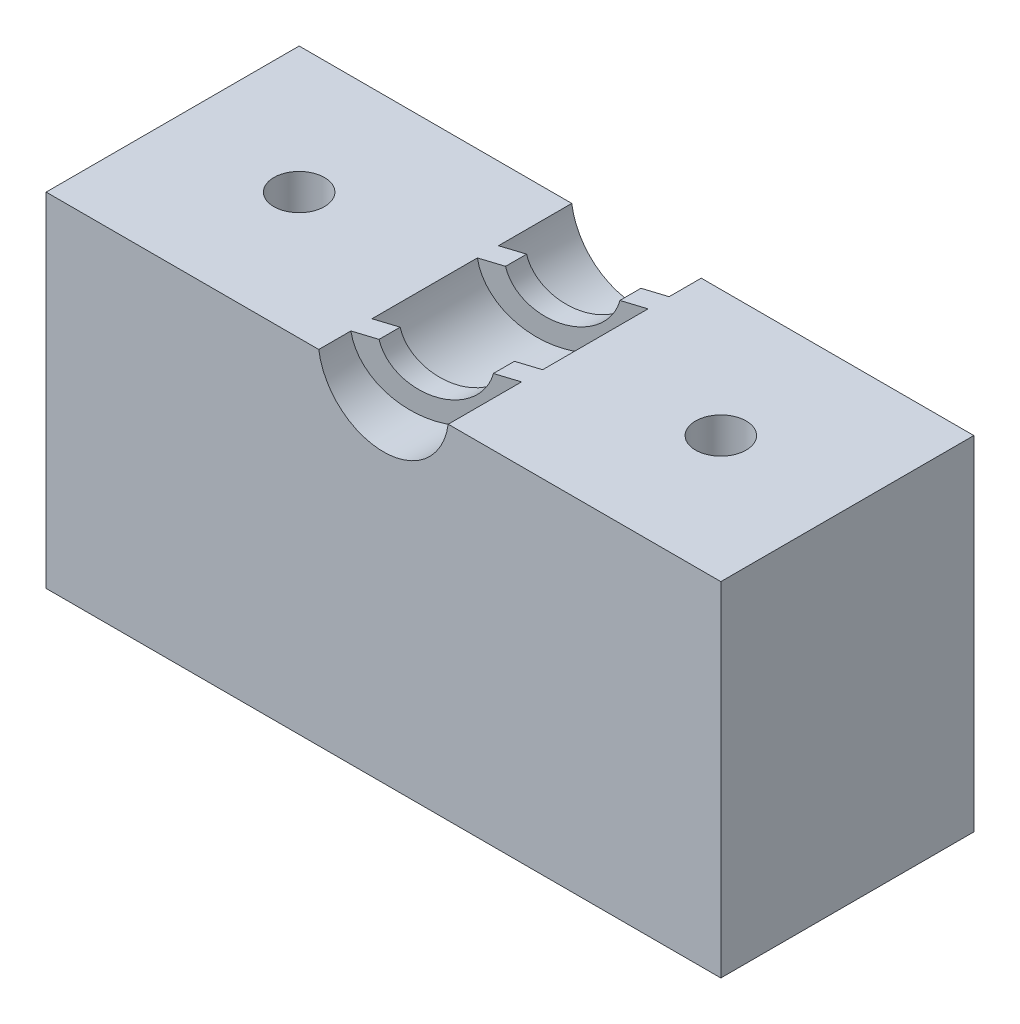
ISO-10303-21;
HEADER;
FILE_DESCRIPTION(('STEP AP214'),'2;1');
FILE_NAME('part.step','',(''),(''),'','','');
FILE_SCHEMA(('AUTOMOTIVE_DESIGN { 1 0 10303 214 1 1 1 1 }'));
ENDSEC;
DATA;
#1=APPLICATION_CONTEXT('core data for automotive mechanical design processes');
#2=APPLICATION_PROTOCOL_DEFINITION('international standard','automotive_design',2000,#1);
#3=PRODUCT_CONTEXT('',#1,'mechanical');
#4=PRODUCT('Part','Part','',(#3));
#5=PRODUCT_RELATED_PRODUCT_CATEGORY('part','',(#4));
#6=PRODUCT_DEFINITION_FORMATION('','',#4);
#7=PRODUCT_DEFINITION_CONTEXT('part definition',#1,'design');
#8=PRODUCT_DEFINITION('design','',#6,#7);
#9=PRODUCT_DEFINITION_SHAPE('','',#8);
#10=(LENGTH_UNIT() NAMED_UNIT(*) SI_UNIT(.MILLI.,.METRE.));
#11=(NAMED_UNIT(*) PLANE_ANGLE_UNIT() SI_UNIT($,.RADIAN.));
#12=(NAMED_UNIT(*) SI_UNIT($,.STERADIAN.) SOLID_ANGLE_UNIT());
#13=UNCERTAINTY_MEASURE_WITH_UNIT(LENGTH_MEASURE(1.E-05),#10,'distance_accuracy_value','');
#14=(GEOMETRIC_REPRESENTATION_CONTEXT(3) GLOBAL_UNCERTAINTY_ASSIGNED_CONTEXT((#13)) GLOBAL_UNIT_ASSIGNED_CONTEXT((#10,
#11,#12)) REPRESENTATION_CONTEXT('',''));
#15=CARTESIAN_POINT('',(0.,0.,0.));
#16=DIRECTION('',(0.,0.,1.));
#17=DIRECTION('',(1.,0.,0.));
#18=AXIS2_PLACEMENT_3D('',#15,#16,#17);
#19=CARTESIAN_POINT('',(0.,0.,3.));
#20=DIRECTION('',(0.,0.,-1.));
#21=DIRECTION('',(-1.,0.,0.));
#22=AXIS2_PLACEMENT_3D('',#19,#20,#21);
#23=CYLINDRICAL_SURFACE('',#22,1.55);
#24=CARTESIAN_POINT('',(0.,0.,-3.));
#25=DIRECTION('',(0.,0.,1.));
#26=DIRECTION('',(1.,0.,0.));
#27=AXIS2_PLACEMENT_3D('',#24,#25,#26);
#28=CIRCLE('',#27,1.55);
#29=CARTESIAN_POINT('',(-1.53514305660554,-0.214092960547071,-3.));
#30=VERTEX_POINT('',#29);
#31=CARTESIAN_POINT('',(1.53514305660554,-0.214092960547071,-3.));
#32=VERTEX_POINT('',#31);
#33=EDGE_CURVE('E235',#30,#32,#28,.T.);
#34=ORIENTED_EDGE('',*,*,#33,.F.);
#35=DIRECTION('',(0.,0.,-1.));
#36=VECTOR('',#35,1.);
#37=CARTESIAN_POINT('',(-1.53514305660554,-0.214092960547071,3.));
#38=LINE('',#37,#36);
#39=CARTESIAN_POINT('',(-1.53514305660554,-0.214092960547072,-1.26125398185195));
#40=VERTEX_POINT('',#39);
#41=EDGE_CURVE('E209',#30,#40,#38,.F.);
#42=ORIENTED_EDGE('',*,*,#41,.T.);
#43=CARTESIAN_POINT('',(0.,0.,-1.75));
#44=DIRECTION('',(-0.303367903708314,0.,-0.952873504196451));
#45=DIRECTION('',(0.952873504196451,0.,-0.303367903708314));
#46=AXIS2_PLACEMENT_3D('',#43,#44,#45);
#47=ELLIPSE('',#46,1.62665872560608,1.55);
#48=CARTESIAN_POINT('',(1.53514305660553,-0.214092960547071,-2.23874601814805));
#49=VERTEX_POINT('',#48);
#50=EDGE_CURVE('E229',#49,#40,#47,.T.);
#51=ORIENTED_EDGE('',*,*,#50,.F.);
#52=DIRECTION('',(0.,0.,-1.));
#53=VECTOR('',#52,1.);
#54=CARTESIAN_POINT('',(1.53514305660554,-0.214092960547071,3.));
#55=LINE('',#54,#53);
#56=EDGE_CURVE('E61',#32,#49,#55,.F.);
#57=ORIENTED_EDGE('',*,*,#56,.F.);
#58=EDGE_LOOP('',(#34,#42,#51,#57));
#59=FACE_BOUND('',#58,.T.);
#60=ADVANCED_FACE('F38',(#59),#23,.F.);
#61=CARTESIAN_POINT('',(0.,0.,1.75));
#62=DIRECTION('',(0.303367903708314,0.,0.952873504196451));
#63=DIRECTION('',(0.952873504196451,0.,-0.303367903708314));
#64=AXIS2_PLACEMENT_3D('',#61,#62,#63);
#65=ELLIPSE('',#64,1.62665872560608,1.55);
#66=CARTESIAN_POINT('',(-1.53514305660554,-0.214092960547072,2.23874601814805));
#67=VERTEX_POINT('',#66);
#68=CARTESIAN_POINT('',(1.53514305660553,-0.214092960547071,1.26125398185195));
#69=VERTEX_POINT('',#68);
#70=EDGE_CURVE('E152',#67,#69,#65,.T.);
#71=ORIENTED_EDGE('',*,*,#70,.F.);
#72=CARTESIAN_POINT('',(-1.53514305660554,-0.214092960547071,3.));
#73=VERTEX_POINT('',#72);
#74=EDGE_CURVE('E213',#67,#73,#38,.F.);
#75=ORIENTED_EDGE('',*,*,#74,.T.);
#76=CARTESIAN_POINT('',(0.,0.,3.));
#77=DIRECTION('',(0.,0.,1.));
#78=DIRECTION('',(1.,0.,0.));
#79=AXIS2_PLACEMENT_3D('',#76,#77,#78);
#80=CIRCLE('',#79,1.55);
#81=CARTESIAN_POINT('',(1.53514305660554,-0.214092960547071,3.));
#82=VERTEX_POINT('',#81);
#83=EDGE_CURVE('E236',#73,#82,#80,.T.);
#84=ORIENTED_EDGE('',*,*,#83,.T.);
#85=EDGE_CURVE('E201',#69,#82,#55,.F.);
#86=ORIENTED_EDGE('',*,*,#85,.F.);
#87=EDGE_LOOP('',(#71,#75,#84,#86));
#88=FACE_BOUND('',#87,.T.);
#89=ADVANCED_FACE('F281',(#88),#23,.F.);
#90=CARTESIAN_POINT('',(0.,0.,3.));
#91=DIRECTION('',(0.,0.,-1.));
#92=DIRECTION('',(-1.,0.,0.));
#93=AXIS2_PLACEMENT_3D('',#90,#91,#92);
#94=PLANE('',#93);
#95=DIRECTION('',(-1.,0.,0.));
#96=VECTOR('',#95,1.);
#97=CARTESIAN_POINT('',(0.,-0.214092960547071,3.));
#98=LINE('',#97,#96);
#99=CARTESIAN_POINT('',(-8.,-0.214092960547072,3.));
#100=VERTEX_POINT('',#99);
#101=EDGE_CURVE('E149',#73,#100,#98,.T.);
#102=ORIENTED_EDGE('',*,*,#101,.T.);
#103=DIRECTION('',(0.,-1.,0.));
#104=VECTOR('',#103,1.);
#105=CARTESIAN_POINT('',(-8.,-8.,3.));
#106=LINE('',#105,#104);
#107=CARTESIAN_POINT('',(-8.,-8.35500000000079,3.));
#108=VERTEX_POINT('',#107);
#109=EDGE_CURVE('E141',#100,#108,#106,.T.);
#110=ORIENTED_EDGE('',*,*,#109,.T.);
#111=DIRECTION('',(-1.,0.,0.));
#112=VECTOR('',#111,1.);
#113=CARTESIAN_POINT('',(8.,-8.35500000000079,3.));
#114=LINE('',#113,#112);
#115=CARTESIAN_POINT('',(8.,-8.35500000000079,3.));
#116=VERTEX_POINT('',#115);
#117=EDGE_CURVE('E146',#116,#108,#114,.T.);
#118=ORIENTED_EDGE('',*,*,#117,.F.);
#119=DIRECTION('',(0.,1.,0.));
#120=VECTOR('',#119,1.);
#121=CARTESIAN_POINT('',(8.,-8.,3.));
#122=LINE('',#121,#120);
#123=CARTESIAN_POINT('',(8.,-0.214092960547071,3.));
#124=VERTEX_POINT('',#123);
#125=EDGE_CURVE('E153',#116,#124,#122,.T.);
#126=ORIENTED_EDGE('',*,*,#125,.T.);
#127=DIRECTION('',(1.,0.,0.));
#128=VECTOR('',#127,1.);
#129=CARTESIAN_POINT('',(0.,-0.214092960547071,3.));
#130=LINE('',#129,#128);
#131=EDGE_CURVE('E179',#82,#124,#130,.T.);
#132=ORIENTED_EDGE('',*,*,#131,.F.);
#133=ORIENTED_EDGE('',*,*,#83,.F.);
#134=EDGE_LOOP('',(#102,#110,#118,#126,#132,#133));
#135=FACE_BOUND('',#134,.T.);
#136=ADVANCED_FACE('F143',(#135),#94,.F.);
#137=CARTESIAN_POINT('',(0.,0.,-3.));
#138=DIRECTION('',(0.,0.,-1.));
#139=DIRECTION('',(-1.,0.,0.));
#140=AXIS2_PLACEMENT_3D('',#137,#138,#139);
#141=PLANE('',#140);
#142=DIRECTION('',(0.,-1.,0.));
#143=VECTOR('',#142,1.);
#144=CARTESIAN_POINT('',(-8.,-8.,-3.));
#145=LINE('',#144,#143);
#146=CARTESIAN_POINT('',(-8.,-0.214092960547072,-3.));
#147=VERTEX_POINT('',#146);
#148=CARTESIAN_POINT('',(-8.,-8.35500000000079,-3.));
#149=VERTEX_POINT('',#148);
#150=EDGE_CURVE('E159',#147,#149,#145,.T.);
#151=ORIENTED_EDGE('',*,*,#150,.F.);
#152=DIRECTION('',(-1.,0.,0.));
#153=VECTOR('',#152,1.);
#154=CARTESIAN_POINT('',(0.,-0.214092960547071,-3.));
#155=LINE('',#154,#153);
#156=EDGE_CURVE('E185',#30,#147,#155,.T.);
#157=ORIENTED_EDGE('',*,*,#156,.F.);
#158=ORIENTED_EDGE('',*,*,#33,.T.);
#159=DIRECTION('',(1.,0.,0.));
#160=VECTOR('',#159,1.);
#161=CARTESIAN_POINT('',(0.,-0.214092960547071,-3.));
#162=LINE('',#161,#160);
#163=CARTESIAN_POINT('',(8.,-0.214092960547071,-3.));
#164=VERTEX_POINT('',#163);
#165=EDGE_CURVE('E182',#32,#164,#162,.T.);
#166=ORIENTED_EDGE('',*,*,#165,.T.);
#167=DIRECTION('',(0.,1.,0.));
#168=VECTOR('',#167,1.);
#169=CARTESIAN_POINT('',(8.,-8.,-3.));
#170=LINE('',#169,#168);
#171=CARTESIAN_POINT('',(8.,-8.35500000000079,-3.));
#172=VERTEX_POINT('',#171);
#173=EDGE_CURVE('E239',#172,#164,#170,.T.);
#174=ORIENTED_EDGE('',*,*,#173,.F.);
#175=DIRECTION('',(1.,0.,0.));
#176=VECTOR('',#175,1.);
#177=CARTESIAN_POINT('',(-8.,-8.35500000000079,-3.));
#178=LINE('',#177,#176);
#179=EDGE_CURVE('E164',#149,#172,#178,.T.);
#180=ORIENTED_EDGE('',*,*,#179,.F.);
#181=EDGE_LOOP('',(#151,#157,#158,#166,#174,#180));
#182=FACE_BOUND('',#181,.T.);
#183=ADVANCED_FACE('F293',(#182),#141,.T.);
#184=CARTESIAN_POINT('',(-8.,-8.,3.));
#185=DIRECTION('',(1.,0.,0.));
#186=DIRECTION('',(0.,0.,-1.));
#187=AXIS2_PLACEMENT_3D('',#184,#185,#186);
#188=PLANE('',#187);
#189=DIRECTION('',(0.,0.,1.));
#190=VECTOR('',#189,1.);
#191=CARTESIAN_POINT('',(-8.,-0.214092960547072,-3.));
#192=LINE('',#191,#190);
#193=EDGE_CURVE('E192',#147,#100,#192,.T.);
#194=ORIENTED_EDGE('',*,*,#193,.F.);
#195=ORIENTED_EDGE('',*,*,#150,.T.);
#196=DIRECTION('',(0.,0.,-1.));
#197=VECTOR('',#196,1.);
#198=CARTESIAN_POINT('',(-8.,-8.35500000000079,3.));
#199=LINE('',#198,#197);
#200=EDGE_CURVE('E156',#108,#149,#199,.T.);
#201=ORIENTED_EDGE('',*,*,#200,.F.);
#202=ORIENTED_EDGE('',*,*,#109,.F.);
#203=EDGE_LOOP('',(#194,#195,#201,#202));
#204=FACE_BOUND('',#203,.T.);
#205=ADVANCED_FACE('F157',(#204),#188,.F.);
#206=CARTESIAN_POINT('',(0.505874665567726,-11.4381719755756,1.58894385124934));
#207=DIRECTION('',(0.303367903708314,0.,0.952873504196451));
#208=DIRECTION('',(0.952873504196451,0.,-0.303367903708314));
#209=AXIS2_PLACEMENT_3D('',#206,#207,#208);
#210=PLANE('',#209);
#211=CARTESIAN_POINT('',(0.,0.,1.75));
#212=DIRECTION('',(0.303367903708314,0.,0.952873504196451));
#213=DIRECTION('',(-0.952873504196451,0.,0.303367903708314));
#214=AXIS2_PLACEMENT_3D('',#211,#212,#213);
#215=ELLIPSE('',#214,1.10193010444283,1.05);
#216=CARTESIAN_POINT('',(-1.02794173193046,-0.214092960547071,2.07726749875684));
#217=VERTEX_POINT('',#216);
#218=CARTESIAN_POINT('',(1.02794173193046,-0.214092960547071,1.42273250124316));
#219=VERTEX_POINT('',#218);
#220=EDGE_CURVE('E224',#217,#219,#215,.T.);
#221=ORIENTED_EDGE('',*,*,#220,.F.);
#222=DIRECTION('',(-0.952873504196451,0.,0.303367903708314));
#223=VECTOR('',#222,1.);
#224=CARTESIAN_POINT('',(0.505874665567725,-0.214092960547071,1.58894385124934));
#225=LINE('',#224,#223);
#226=EDGE_CURVE('E219',#217,#67,#225,.T.);
#227=ORIENTED_EDGE('',*,*,#226,.T.);
#228=ORIENTED_EDGE('',*,*,#70,.T.);
#229=DIRECTION('',(0.952873504196451,0.,-0.303367903708314));
#230=VECTOR('',#229,1.);
#231=CARTESIAN_POINT('',(0.505874665567726,-0.214092960547071,1.58894385124934));
#232=LINE('',#231,#230);
#233=EDGE_CURVE('E207',#219,#69,#232,.T.);
#234=ORIENTED_EDGE('',*,*,#233,.F.);
#235=EDGE_LOOP('',(#221,#227,#228,#234));
#236=FACE_BOUND('',#235,.T.);
#237=ADVANCED_FACE('F277',(#236),#210,.T.);
#238=CARTESIAN_POINT('',(-0.505874665567727,-11.4381719755756,-1.58894385124934));
#239=DIRECTION('',(-0.303367903708314,0.,-0.952873504196451));
#240=DIRECTION('',(-0.952873504196451,0.,0.303367903708314));
#241=AXIS2_PLACEMENT_3D('',#238,#239,#240);
#242=PLANE('',#241);
#243=ORIENTED_EDGE('',*,*,#50,.T.);
#244=DIRECTION('',(0.952873504196451,0.,-0.303367903708314));
#245=VECTOR('',#244,1.);
#246=CARTESIAN_POINT('',(-0.505874665567728,-0.214092960547071,-1.58894385124934));
#247=LINE('',#246,#245);
#248=CARTESIAN_POINT('',(-1.02794173193046,-0.214092960547071,-1.42273250124316));
#249=VERTEX_POINT('',#248);
#250=EDGE_CURVE('E12',#40,#249,#247,.T.);
#251=ORIENTED_EDGE('',*,*,#250,.T.);
#252=CARTESIAN_POINT('',(0.,0.,-1.75));
#253=DIRECTION('',(-0.303367903708314,0.,-0.952873504196451));
#254=DIRECTION('',(-0.952873504196451,0.,0.303367903708314));
#255=AXIS2_PLACEMENT_3D('',#252,#253,#254);
#256=ELLIPSE('',#255,1.10193010444283,1.05);
#257=CARTESIAN_POINT('',(1.02794173193046,-0.214092960547071,-2.07726749875684));
#258=VERTEX_POINT('',#257);
#259=EDGE_CURVE('E47',#258,#249,#256,.T.);
#260=ORIENTED_EDGE('',*,*,#259,.F.);
#261=DIRECTION('',(-0.952873504196451,0.,0.303367903708314));
#262=VECTOR('',#261,1.);
#263=CARTESIAN_POINT('',(-0.505874665567727,-0.214092960547071,-1.58894385124934));
#264=LINE('',#263,#262);
#265=EDGE_CURVE('E251',#49,#258,#264,.T.);
#266=ORIENTED_EDGE('',*,*,#265,.F.);
#267=EDGE_LOOP('',(#243,#251,#260,#266));
#268=FACE_BOUND('',#267,.T.);
#269=ADVANCED_FACE('F299',(#268),#242,.T.);
#270=CARTESIAN_POINT('',(8.,-8.,3.));
#271=DIRECTION('',(-1.,0.,0.));
#272=DIRECTION('',(0.,0.,1.));
#273=AXIS2_PLACEMENT_3D('',#270,#271,#272);
#274=PLANE('',#273);
#275=ORIENTED_EDGE('',*,*,#173,.T.);
#276=DIRECTION('',(0.,0.,1.));
#277=VECTOR('',#276,1.);
#278=CARTESIAN_POINT('',(8.,-0.214092960547071,-3.));
#279=LINE('',#278,#277);
#280=EDGE_CURVE('E194',#164,#124,#279,.T.);
#281=ORIENTED_EDGE('',*,*,#280,.T.);
#282=ORIENTED_EDGE('',*,*,#125,.F.);
#283=DIRECTION('',(0.,0.,1.));
#284=VECTOR('',#283,1.);
#285=CARTESIAN_POINT('',(8.,-8.35500000000079,-3.));
#286=LINE('',#285,#284);
#287=EDGE_CURVE('E168',#172,#116,#286,.T.);
#288=ORIENTED_EDGE('',*,*,#287,.F.);
#289=EDGE_LOOP('',(#275,#281,#282,#288));
#290=FACE_BOUND('',#289,.T.);
#291=ADVANCED_FACE('F40',(#290),#274,.F.);
#292=CARTESIAN_POINT('',(0.,0.,-3.));
#293=DIRECTION('',(0.,0.,1.));
#294=DIRECTION('',(1.,0.,0.));
#295=AXIS2_PLACEMENT_3D('',#292,#293,#294);
#296=CYLINDRICAL_SURFACE('',#295,1.05);
#297=DIRECTION('',(0.,0.,1.));
#298=VECTOR('',#297,1.);
#299=CARTESIAN_POINT('',(-1.02794173193046,-0.214092960547071,-3.));
#300=LINE('',#299,#298);
#301=CARTESIAN_POINT('',(-1.02794173193046,-0.214092960547071,1.57726749875684));
#302=VERTEX_POINT('',#301);
#303=EDGE_CURVE('E188',#302,#217,#300,.T.);
#304=ORIENTED_EDGE('',*,*,#303,.T.);
#305=ORIENTED_EDGE('',*,*,#220,.T.);
#306=DIRECTION('',(0.,0.,1.));
#307=VECTOR('',#306,1.);
#308=CARTESIAN_POINT('',(1.02794173193046,-0.214092960547071,-3.));
#309=LINE('',#308,#307);
#310=CARTESIAN_POINT('',(1.02794173193046,-0.214092960547071,0.92273250124316));
#311=VERTEX_POINT('',#310);
#312=EDGE_CURVE('E187',#311,#219,#309,.T.);
#313=ORIENTED_EDGE('',*,*,#312,.F.);
#314=CARTESIAN_POINT('',(0.,0.,1.25));
#315=DIRECTION('',(0.303367903708314,0.,0.952873504196451));
#316=DIRECTION('',(-0.952873504196451,0.,0.303367903708314));
#317=AXIS2_PLACEMENT_3D('',#314,#315,#316);
#318=ELLIPSE('',#317,1.10193010444283,1.05);
#319=EDGE_CURVE('E226',#302,#311,#318,.T.);
#320=ORIENTED_EDGE('',*,*,#319,.F.);
#321=EDGE_LOOP('',(#304,#305,#313,#320));
#322=FACE_BOUND('',#321,.T.);
#323=ADVANCED_FACE('F266',(#322),#296,.F.);
#324=CARTESIAN_POINT('',(0.,-0.214092960547071,-3.));
#325=DIRECTION('',(0.,1.,0.));
#326=DIRECTION('',(-1.,0.,0.));
#327=AXIS2_PLACEMENT_3D('',#324,#325,#326);
#328=PLANE('',#327);
#329=CARTESIAN_POINT('',(-5.,-0.214092960547072,0.));
#330=DIRECTION('',(0.,1.,0.));
#331=DIRECTION('',(-1.,0.,0.));
#332=AXIS2_PLACEMENT_3D('',#329,#330,#331);
#333=CIRCLE('',#332,0.6);
#334=CARTESIAN_POINT('',(-5.6,-0.214092960547072,0.));
#335=VERTEX_POINT('',#334);
#336=EDGE_CURVE('E42',#335,#335,#333,.T.);
#337=ORIENTED_EDGE('',*,*,#336,.F.);
#338=EDGE_LOOP('',(#337));
#339=FACE_BOUND('',#338,.T.);
#340=ORIENTED_EDGE('',*,*,#226,.F.);
#341=ORIENTED_EDGE('',*,*,#303,.F.);
#342=DIRECTION('',(-0.952873504196451,0.,0.303367903708314));
#343=VECTOR('',#342,1.);
#344=CARTESIAN_POINT('',(0.361339046834089,-0.214092960547071,1.13495989374953));
#345=LINE('',#344,#343);
#346=CARTESIAN_POINT('',(-1.53514305660554,-0.214092960547071,1.73874601814805));
#347=VERTEX_POINT('',#346);
#348=EDGE_CURVE('E217',#302,#347,#345,.T.);
#349=ORIENTED_EDGE('',*,*,#348,.T.);
#350=CARTESIAN_POINT('',(-1.53514305660554,-0.214092960547072,-0.76125398185195));
#351=VERTEX_POINT('',#350);
#352=EDGE_CURVE('E214',#351,#347,#38,.F.);
#353=ORIENTED_EDGE('',*,*,#352,.F.);
#354=DIRECTION('',(-0.952873504196451,0.,0.303367903708314));
#355=VECTOR('',#354,1.);
#356=CARTESIAN_POINT('',(-0.361339046834092,-0.214092960547071,-1.13495989374953));
#357=LINE('',#356,#355);
#358=CARTESIAN_POINT('',(-1.02794173193046,-0.214092960547071,-0.922732501243162));
#359=VERTEX_POINT('',#358);
#360=EDGE_CURVE('E212',#359,#351,#357,.T.);
#361=ORIENTED_EDGE('',*,*,#360,.F.);
#362=EDGE_CURVE('E191',#249,#359,#300,.T.);
#363=ORIENTED_EDGE('',*,*,#362,.F.);
#364=ORIENTED_EDGE('',*,*,#250,.F.);
#365=ORIENTED_EDGE('',*,*,#41,.F.);
#366=ORIENTED_EDGE('',*,*,#156,.T.);
#367=ORIENTED_EDGE('',*,*,#193,.T.);
#368=ORIENTED_EDGE('',*,*,#101,.F.);
#369=ORIENTED_EDGE('',*,*,#74,.F.);
#370=EDGE_LOOP('',(#340,#341,#349,#353,#361,#363,#364,#365,#366,#367,#368,#369));
#371=FACE_BOUND('',#370,.T.);
#372=ADVANCED_FACE('F262',(#339,#371),#328,.T.);
#373=CARTESIAN_POINT('',(0.,-0.214092960547071,-3.));
#374=DIRECTION('',(0.,-1.,0.));
#375=DIRECTION('',(1.,0.,0.));
#376=AXIS2_PLACEMENT_3D('',#373,#374,#375);
#377=PLANE('',#376);
#378=CARTESIAN_POINT('',(5.,-0.214092960547071,0.));
#379=DIRECTION('',(0.,-1.,0.));
#380=DIRECTION('',(1.,0.,0.));
#381=AXIS2_PLACEMENT_3D('',#378,#379,#380);
#382=CIRCLE('',#381,0.6);
#383=CARTESIAN_POINT('',(5.6,-0.214092960547071,0.));
#384=VERTEX_POINT('',#383);
#385=EDGE_CURVE('E163',#384,#384,#382,.T.);
#386=ORIENTED_EDGE('',*,*,#385,.T.);
#387=EDGE_LOOP('',(#386));
#388=FACE_BOUND('',#387,.T.);
#389=ORIENTED_EDGE('',*,*,#85,.T.);
#390=ORIENTED_EDGE('',*,*,#131,.T.);
#391=ORIENTED_EDGE('',*,*,#280,.F.);
#392=ORIENTED_EDGE('',*,*,#165,.F.);
#393=ORIENTED_EDGE('',*,*,#56,.T.);
#394=ORIENTED_EDGE('',*,*,#265,.T.);
#395=CARTESIAN_POINT('',(1.02794173193046,-0.214092960547071,-1.57726749875684));
#396=VERTEX_POINT('',#395);
#397=EDGE_CURVE('E55',#258,#396,#309,.T.);
#398=ORIENTED_EDGE('',*,*,#397,.T.);
#399=DIRECTION('',(0.952873504196451,0.,-0.303367903708314));
#400=VECTOR('',#399,1.);
#401=CARTESIAN_POINT('',(-0.361339046834091,-0.214092960547071,-1.13495989374953));
#402=LINE('',#401,#400);
#403=CARTESIAN_POINT('',(1.53514305660554,-0.214092960547071,-1.73874601814805));
#404=VERTEX_POINT('',#403);
#405=EDGE_CURVE('E200',#396,#404,#402,.T.);
#406=ORIENTED_EDGE('',*,*,#405,.T.);
#407=CARTESIAN_POINT('',(1.53514305660554,-0.214092960547071,0.761253981851949));
#408=VERTEX_POINT('',#407);
#409=EDGE_CURVE('E202',#404,#408,#55,.F.);
#410=ORIENTED_EDGE('',*,*,#409,.T.);
#411=DIRECTION('',(0.952873504196451,0.,-0.303367903708314));
#412=VECTOR('',#411,1.);
#413=CARTESIAN_POINT('',(0.36133904683409,-0.214092960547071,1.13495989374953));
#414=LINE('',#413,#412);
#415=EDGE_CURVE('E204',#311,#408,#414,.T.);
#416=ORIENTED_EDGE('',*,*,#415,.F.);
#417=ORIENTED_EDGE('',*,*,#312,.T.);
#418=ORIENTED_EDGE('',*,*,#233,.T.);
#419=EDGE_LOOP('',(#389,#390,#391,#392,#393,#394,#398,#406,#410,#416,#417,#418));
#420=FACE_BOUND('',#419,.T.);
#421=ADVANCED_FACE('F265',(#388,#420),#377,.F.);
#422=CARTESIAN_POINT('',(0.,0.,-1.25));
#423=DIRECTION('',(0.303367903708314,0.,0.952873504196451));
#424=DIRECTION('',(-0.952873504196451,0.,0.303367903708314));
#425=AXIS2_PLACEMENT_3D('',#422,#423,#424);
#426=ELLIPSE('',#425,1.10193010444283,1.05);
#427=EDGE_CURVE('E222',#359,#396,#426,.T.);
#428=ORIENTED_EDGE('',*,*,#427,.T.);
#429=ORIENTED_EDGE('',*,*,#397,.F.);
#430=ORIENTED_EDGE('',*,*,#259,.T.);
#431=ORIENTED_EDGE('',*,*,#362,.T.);
#432=EDGE_LOOP('',(#428,#429,#430,#431));
#433=FACE_BOUND('',#432,.T.);
#434=ADVANCED_FACE('F302',(#433),#296,.F.);
#435=CARTESIAN_POINT('',(0.36133904683409,-11.4381719755756,1.13495989374953));
#436=DIRECTION('',(0.303367903708314,0.,0.952873504196451));
#437=DIRECTION('',(0.952873504196451,0.,-0.303367903708314));
#438=AXIS2_PLACEMENT_3D('',#435,#436,#437);
#439=PLANE('',#438);
#440=ORIENTED_EDGE('',*,*,#348,.F.);
#441=ORIENTED_EDGE('',*,*,#319,.T.);
#442=ORIENTED_EDGE('',*,*,#415,.T.);
#443=CARTESIAN_POINT('',(0.,0.,1.25));
#444=DIRECTION('',(0.303367903708314,0.,0.952873504196451));
#445=DIRECTION('',(0.952873504196451,0.,-0.303367903708314));
#446=AXIS2_PLACEMENT_3D('',#443,#444,#445);
#447=ELLIPSE('',#446,1.62665872560608,1.55);
#448=EDGE_CURVE('E248',#347,#408,#447,.T.);
#449=ORIENTED_EDGE('',*,*,#448,.F.);
#450=EDGE_LOOP('',(#440,#441,#442,#449));
#451=FACE_BOUND('',#450,.T.);
#452=ADVANCED_FACE('F288',(#451),#439,.F.);
#453=CARTESIAN_POINT('',(-0.361339046834091,-11.4381719755756,-1.13495989374953));
#454=DIRECTION('',(0.303367903708314,0.,0.952873504196451));
#455=DIRECTION('',(0.952873504196451,0.,-0.303367903708314));
#456=AXIS2_PLACEMENT_3D('',#453,#454,#455);
#457=PLANE('',#456);
#458=ORIENTED_EDGE('',*,*,#427,.F.);
#459=ORIENTED_EDGE('',*,*,#360,.T.);
#460=CARTESIAN_POINT('',(0.,0.,-1.25));
#461=DIRECTION('',(0.303367903708314,0.,0.952873504196451));
#462=DIRECTION('',(0.952873504196451,0.,-0.303367903708314));
#463=AXIS2_PLACEMENT_3D('',#460,#461,#462);
#464=ELLIPSE('',#463,1.62665872560608,1.55);
#465=EDGE_CURVE('E232',#351,#404,#464,.T.);
#466=ORIENTED_EDGE('',*,*,#465,.T.);
#467=ORIENTED_EDGE('',*,*,#405,.F.);
#468=EDGE_LOOP('',(#458,#459,#466,#467));
#469=FACE_BOUND('',#468,.T.);
#470=ADVANCED_FACE('F307',(#469),#457,.T.);
#471=ORIENTED_EDGE('',*,*,#465,.F.);
#472=ORIENTED_EDGE('',*,*,#352,.T.);
#473=ORIENTED_EDGE('',*,*,#448,.T.);
#474=ORIENTED_EDGE('',*,*,#409,.F.);
#475=EDGE_LOOP('',(#471,#472,#473,#474));
#476=FACE_BOUND('',#475,.T.);
#477=ADVANCED_FACE('F290',(#476),#23,.F.);
#478=CARTESIAN_POINT('',(5.,-8.,0.));
#479=DIRECTION('',(0.,1.,0.));
#480=DIRECTION('',(0.,0.,1.));
#481=AXIS2_PLACEMENT_3D('',#478,#479,#480);
#482=CYLINDRICAL_SURFACE('',#481,0.6);
#483=ORIENTED_EDGE('',*,*,#385,.F.);
#484=EDGE_LOOP('',(#483));
#485=FACE_BOUND('',#484,.T.);
#486=CARTESIAN_POINT('',(5.,-8.35500000000079,0.));
#487=DIRECTION('',(0.,-1.,0.));
#488=DIRECTION('',(1.,0.,0.));
#489=AXIS2_PLACEMENT_3D('',#486,#487,#488);
#490=CIRCLE('',#489,0.6);
#491=CARTESIAN_POINT('',(5.6,-8.35500000000079,0.));
#492=VERTEX_POINT('',#491);
#493=EDGE_CURVE('E173',#492,#492,#490,.T.);
#494=ORIENTED_EDGE('',*,*,#493,.T.);
#495=EDGE_LOOP('',(#494));
#496=FACE_BOUND('',#495,.T.);
#497=ADVANCED_FACE('F314',(#485,#496),#482,.F.);
#498=CARTESIAN_POINT('',(-5.,-8.,0.));
#499=DIRECTION('',(0.,1.,0.));
#500=DIRECTION('',(0.,0.,1.));
#501=AXIS2_PLACEMENT_3D('',#498,#499,#500);
#502=CYLINDRICAL_SURFACE('',#501,0.6);
#503=ORIENTED_EDGE('',*,*,#336,.T.);
#504=EDGE_LOOP('',(#503));
#505=FACE_BOUND('',#504,.T.);
#506=CARTESIAN_POINT('',(-5.,-8.35500000000079,0.));
#507=DIRECTION('',(0.,-1.,0.));
#508=DIRECTION('',(1.,0.,0.));
#509=AXIS2_PLACEMENT_3D('',#506,#507,#508);
#510=CIRCLE('',#509,0.6);
#511=CARTESIAN_POINT('',(-4.4,-8.35500000000079,0.));
#512=VERTEX_POINT('',#511);
#513=EDGE_CURVE('E169',#512,#512,#510,.T.);
#514=ORIENTED_EDGE('',*,*,#513,.T.);
#515=EDGE_LOOP('',(#514));
#516=FACE_BOUND('',#515,.T.);
#517=ADVANCED_FACE('F259',(#505,#516),#502,.F.);
#518=CARTESIAN_POINT('',(27.7477781678247,-8.35500000000078,-11.));
#519=DIRECTION('',(0.,-1.,0.));
#520=DIRECTION('',(0.,0.,-1.));
#521=AXIS2_PLACEMENT_3D('',#518,#519,#520);
#522=PLANE('',#521);
#523=ORIENTED_EDGE('',*,*,#493,.F.);
#524=EDGE_LOOP('',(#523));
#525=FACE_BOUND('',#524,.T.);
#526=ORIENTED_EDGE('',*,*,#513,.F.);
#527=EDGE_LOOP('',(#526));
#528=FACE_BOUND('',#527,.T.);
#529=ORIENTED_EDGE('',*,*,#117,.T.);
#530=ORIENTED_EDGE('',*,*,#200,.T.);
#531=ORIENTED_EDGE('',*,*,#179,.T.);
#532=ORIENTED_EDGE('',*,*,#287,.T.);
#533=EDGE_LOOP('',(#529,#530,#531,#532));
#534=FACE_BOUND('',#533,.T.);
#535=ADVANCED_FACE('F166',(#525,#528,#534),#522,.T.);
#536=CLOSED_SHELL('',(#60,#89,#136,#183,#205,#237,#269,#291,#323,#372,#421,#434,#452,#470,#477,
#497,#517,#535));
#537=MANIFOLD_SOLID_BREP('B2',#536);
#538=ADVANCED_BREP_SHAPE_REPRESENTATION('',(#18,#537),#14);
#539=SHAPE_DEFINITION_REPRESENTATION(#9,#538);
ENDSEC;
END-ISO-10303-21;
